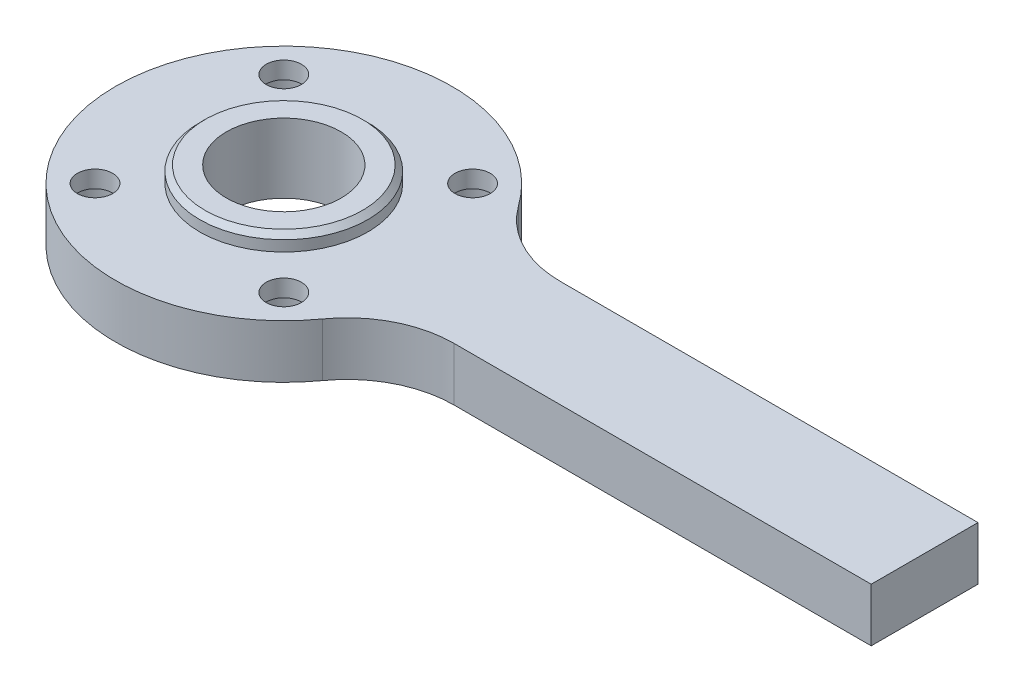
ISO-10303-21;
HEADER;
FILE_DESCRIPTION(('STEP AP214'),'2;1');
FILE_NAME('part.step','',(''),(''),'','','');
FILE_SCHEMA(('AUTOMOTIVE_DESIGN { 1 0 10303 214 1 1 1 1 }'));
ENDSEC;
DATA;
#1=APPLICATION_CONTEXT('core data for automotive mechanical design processes');
#2=APPLICATION_PROTOCOL_DEFINITION('international standard','automotive_design',2000,#1);
#3=PRODUCT_CONTEXT('',#1,'mechanical');
#4=PRODUCT('Part','Part','',(#3));
#5=PRODUCT_RELATED_PRODUCT_CATEGORY('part','',(#4));
#6=PRODUCT_DEFINITION_FORMATION('','',#4);
#7=PRODUCT_DEFINITION_CONTEXT('part definition',#1,'design');
#8=PRODUCT_DEFINITION('design','',#6,#7);
#9=PRODUCT_DEFINITION_SHAPE('','',#8);
#10=(LENGTH_UNIT() NAMED_UNIT(*) SI_UNIT(.MILLI.,.METRE.));
#11=(NAMED_UNIT(*) PLANE_ANGLE_UNIT() SI_UNIT($,.RADIAN.));
#12=(NAMED_UNIT(*) SI_UNIT($,.STERADIAN.) SOLID_ANGLE_UNIT());
#13=UNCERTAINTY_MEASURE_WITH_UNIT(LENGTH_MEASURE(1.E-05),#10,'distance_accuracy_value','');
#14=(GEOMETRIC_REPRESENTATION_CONTEXT(3) GLOBAL_UNCERTAINTY_ASSIGNED_CONTEXT((#13)) GLOBAL_UNIT_ASSIGNED_CONTEXT((#10,
#11,#12)) REPRESENTATION_CONTEXT('',''));
#15=CARTESIAN_POINT('',(0.,0.,0.));
#16=DIRECTION('',(0.,0.,1.));
#17=DIRECTION('',(1.,0.,0.));
#18=AXIS2_PLACEMENT_3D('',#15,#16,#17);
#19=CARTESIAN_POINT('',(0.,10.,0.));
#20=DIRECTION('',(0.,-1.,0.));
#21=DIRECTION('',(0.,0.,-1.));
#22=AXIS2_PLACEMENT_3D('',#19,#20,#21);
#23=CYLINDRICAL_SURFACE('',#22,31.5);
#24=CARTESIAN_POINT('',(0.,0.,0.));
#25=DIRECTION('',(0.,1.,0.));
#26=DIRECTION('',(0.,0.,1.));
#27=AXIS2_PLACEMENT_3D('',#24,#25,#26);
#28=CIRCLE('',#27,31.5);
#29=CARTESIAN_POINT('',(25.6036191835907,0.,-18.3495145631068));
#30=VERTEX_POINT('',#29);
#31=CARTESIAN_POINT('',(25.6036191835907,0.,18.3495145631068));
#32=VERTEX_POINT('',#31);
#33=EDGE_CURVE('E157',#30,#32,#28,.T.);
#34=ORIENTED_EDGE('',*,*,#33,.T.);
#35=DIRECTION('',(0.,-1.,0.));
#36=VECTOR('',#35,1.);
#37=CARTESIAN_POINT('',(25.6036191835907,10.,18.3495145631068));
#38=LINE('',#37,#36);
#39=CARTESIAN_POINT('',(25.6036191835907,10.,18.3495145631068));
#40=VERTEX_POINT('',#39);
#41=EDGE_CURVE('E56',#32,#40,#38,.F.);
#42=ORIENTED_EDGE('',*,*,#41,.T.);
#43=CARTESIAN_POINT('',(0.,10.,0.));
#44=DIRECTION('',(0.,1.,0.));
#45=DIRECTION('',(0.,0.,1.));
#46=AXIS2_PLACEMENT_3D('',#43,#44,#45);
#47=CIRCLE('',#46,31.5);
#48=CARTESIAN_POINT('',(25.6036191835907,10.,-18.3495145631068));
#49=VERTEX_POINT('',#48);
#50=EDGE_CURVE('E162',#49,#40,#47,.T.);
#51=ORIENTED_EDGE('',*,*,#50,.F.);
#52=DIRECTION('',(0.,-1.,0.));
#53=VECTOR('',#52,1.);
#54=CARTESIAN_POINT('',(25.6036191835907,10.,-18.3495145631068));
#55=LINE('',#54,#53);
#56=EDGE_CURVE('E181',#49,#30,#55,.T.);
#57=ORIENTED_EDGE('',*,*,#56,.T.);
#58=EDGE_LOOP('',(#34,#42,#51,#57));
#59=FACE_BOUND('',#58,.T.);
#60=ADVANCED_FACE('F35',(#59),#23,.T.);
#61=CARTESIAN_POINT('',(0.,0.,0.));
#62=DIRECTION('',(0.,1.,0.));
#63=DIRECTION('',(0.,0.,1.));
#64=AXIS2_PLACEMENT_3D('',#61,#62,#63);
#65=PLANE('',#64);
#66=CARTESIAN_POINT('',(0.,0.,0.));
#67=DIRECTION('',(0.,-1.,0.));
#68=DIRECTION('',(0.,0.,-1.));
#69=AXIS2_PLACEMENT_3D('',#66,#67,#68);
#70=CIRCLE('',#69,10.75);
#71=CARTESIAN_POINT('',(0.,0.,-10.75));
#72=VERTEX_POINT('',#71);
#73=EDGE_CURVE('E203',#72,#72,#70,.T.);
#74=ORIENTED_EDGE('',*,*,#73,.F.);
#75=EDGE_LOOP('',(#74));
#76=FACE_BOUND('',#75,.T.);
#77=ORIENTED_EDGE('',*,*,#33,.F.);
#78=CARTESIAN_POINT('',(41.8598853319022,0.,-30.));
#79=DIRECTION('',(0.,1.,0.));
#80=DIRECTION('',(0.,0.,1.));
#81=AXIS2_PLACEMENT_3D('',#78,#79,#80);
#82=CIRCLE('',#81,20.);
#83=CARTESIAN_POINT('',(41.8598853319022,0.,-10.));
#84=VERTEX_POINT('',#83);
#85=EDGE_CURVE('E185',#30,#84,#82,.T.);
#86=ORIENTED_EDGE('',*,*,#85,.T.);
#87=DIRECTION('',(-1.,0.,0.));
#88=VECTOR('',#87,1.);
#89=CARTESIAN_POINT('',(120.,0.,-10.));
#90=LINE('',#89,#88);
#91=CARTESIAN_POINT('',(120.,0.,-10.));
#92=VERTEX_POINT('',#91);
#93=EDGE_CURVE('E198',#92,#84,#90,.T.);
#94=ORIENTED_EDGE('',*,*,#93,.F.);
#95=DIRECTION('',(0.,0.,-1.));
#96=VECTOR('',#95,1.);
#97=CARTESIAN_POINT('',(120.,0.,10.));
#98=LINE('',#97,#96);
#99=CARTESIAN_POINT('',(120.,0.,10.));
#100=VERTEX_POINT('',#99);
#101=EDGE_CURVE('E104',#100,#92,#98,.T.);
#102=ORIENTED_EDGE('',*,*,#101,.F.);
#103=DIRECTION('',(-1.,0.,0.));
#104=VECTOR('',#103,1.);
#105=CARTESIAN_POINT('',(120.,0.,10.));
#106=LINE('',#105,#104);
#107=CARTESIAN_POINT('',(41.8598853319022,0.,10.));
#108=VERTEX_POINT('',#107);
#109=EDGE_CURVE('E119',#100,#108,#106,.T.);
#110=ORIENTED_EDGE('',*,*,#109,.T.);
#111=CARTESIAN_POINT('',(41.8598853319022,0.,30.));
#112=DIRECTION('',(0.,1.,0.));
#113=DIRECTION('',(0.,0.,1.));
#114=AXIS2_PLACEMENT_3D('',#111,#112,#113);
#115=CIRCLE('',#114,20.);
#116=EDGE_CURVE('E43',#108,#32,#115,.T.);
#117=ORIENTED_EDGE('',*,*,#116,.T.);
#118=EDGE_LOOP('',(#77,#86,#94,#102,#110,#117));
#119=FACE_BOUND('',#118,.T.);
#120=CARTESIAN_POINT('',(17.6776695296637,0.,17.6776695296637));
#121=DIRECTION('',(0.,-1.,0.));
#122=DIRECTION('',(0.,0.,-1.));
#123=AXIS2_PLACEMENT_3D('',#120,#121,#122);
#124=CIRCLE('',#123,5.50000000000002);
#125=CARTESIAN_POINT('',(17.6776695296637,0.,12.1776695296637));
#126=VERTEX_POINT('',#125);
#127=EDGE_CURVE('E126',#126,#126,#124,.T.);
#128=ORIENTED_EDGE('',*,*,#127,.F.);
#129=EDGE_LOOP('',(#128));
#130=FACE_BOUND('',#129,.T.);
#131=CARTESIAN_POINT('',(-17.6776695296637,0.,17.6776695296637));
#132=DIRECTION('',(0.,1.,0.));
#133=DIRECTION('',(0.,0.,1.));
#134=AXIS2_PLACEMENT_3D('',#131,#132,#133);
#135=CIRCLE('',#134,5.50000000000002);
#136=CARTESIAN_POINT('',(-17.6776695296637,0.,23.1776695296637));
#137=VERTEX_POINT('',#136);
#138=EDGE_CURVE('E129',#137,#137,#135,.T.);
#139=ORIENTED_EDGE('',*,*,#138,.T.);
#140=EDGE_LOOP('',(#139));
#141=FACE_BOUND('',#140,.T.);
#142=CARTESIAN_POINT('',(17.6776695296637,0.,-17.6776695296637));
#143=DIRECTION('',(0.,1.,0.));
#144=DIRECTION('',(0.,0.,1.));
#145=AXIS2_PLACEMENT_3D('',#142,#143,#144);
#146=CIRCLE('',#145,5.50000000000002);
#147=CARTESIAN_POINT('',(17.6776695296637,0.,-12.1776695296637));
#148=VERTEX_POINT('',#147);
#149=EDGE_CURVE('E117',#148,#148,#146,.T.);
#150=ORIENTED_EDGE('',*,*,#149,.T.);
#151=EDGE_LOOP('',(#150));
#152=FACE_BOUND('',#151,.T.);
#153=CARTESIAN_POINT('',(-17.6776695296637,0.,-17.6776695296637));
#154=DIRECTION('',(0.,-1.,0.));
#155=DIRECTION('',(0.,0.,-1.));
#156=AXIS2_PLACEMENT_3D('',#153,#154,#155);
#157=CIRCLE('',#156,5.50000000000002);
#158=CARTESIAN_POINT('',(-17.6776695296637,0.,-23.1776695296637));
#159=VERTEX_POINT('',#158);
#160=EDGE_CURVE('E133',#159,#159,#157,.T.);
#161=ORIENTED_EDGE('',*,*,#160,.F.);
#162=EDGE_LOOP('',(#161));
#163=FACE_BOUND('',#162,.T.);
#164=ADVANCED_FACE('F196',(#76,#119,#130,#141,#152,#163),#65,.F.);
#165=CARTESIAN_POINT('',(-17.6776695296637,13.,-17.6776695296637));
#166=DIRECTION('',(0.,-1.,0.));
#167=DIRECTION('',(0.,0.,-1.));
#168=AXIS2_PLACEMENT_3D('',#165,#166,#167);
#169=CYLINDRICAL_SURFACE('',#168,3.30000000000002);
#170=CARTESIAN_POINT('',(-17.6776695296637,10.,-17.6776695296637));
#171=DIRECTION('',(0.,1.,0.));
#172=DIRECTION('',(0.,0.,1.));
#173=AXIS2_PLACEMENT_3D('',#170,#171,#172);
#174=CIRCLE('',#173,3.30000000000002);
#175=CARTESIAN_POINT('',(-17.6776695296637,10.,-14.3776695296637));
#176=VERTEX_POINT('',#175);
#177=EDGE_CURVE('E151',#176,#176,#174,.T.);
#178=ORIENTED_EDGE('',*,*,#177,.T.);
#179=EDGE_LOOP('',(#178));
#180=FACE_BOUND('',#179,.T.);
#181=CARTESIAN_POINT('',(-17.6776695296637,6.8,-17.6776695296637));
#182=DIRECTION('',(0.,-1.,0.));
#183=DIRECTION('',(0.,0.,-1.));
#184=AXIS2_PLACEMENT_3D('',#181,#182,#183);
#185=CIRCLE('',#184,3.30000000000002);
#186=CARTESIAN_POINT('',(-17.6776695296637,6.8,-20.9776695296637));
#187=VERTEX_POINT('',#186);
#188=EDGE_CURVE('E167',#187,#187,#185,.F.);
#189=ORIENTED_EDGE('',*,*,#188,.F.);
#190=EDGE_LOOP('',(#189));
#191=FACE_BOUND('',#190,.T.);
#192=ADVANCED_FACE('F219',(#180,#191),#169,.F.);
#193=CARTESIAN_POINT('',(17.6776695296637,13.,17.6776695296637));
#194=DIRECTION('',(0.,-1.,0.));
#195=DIRECTION('',(0.,0.,-1.));
#196=AXIS2_PLACEMENT_3D('',#193,#194,#195);
#197=CYLINDRICAL_SURFACE('',#196,3.30000000000002);
#198=CARTESIAN_POINT('',(17.6776695296637,10.,17.6776695296637));
#199=DIRECTION('',(0.,1.,0.));
#200=DIRECTION('',(0.,0.,1.));
#201=AXIS2_PLACEMENT_3D('',#198,#199,#200);
#202=CIRCLE('',#201,3.30000000000002);
#203=CARTESIAN_POINT('',(17.6776695296637,10.,20.9776695296637));
#204=VERTEX_POINT('',#203);
#205=EDGE_CURVE('E154',#204,#204,#202,.T.);
#206=ORIENTED_EDGE('',*,*,#205,.T.);
#207=EDGE_LOOP('',(#206));
#208=FACE_BOUND('',#207,.T.);
#209=CARTESIAN_POINT('',(17.6776695296637,6.8,17.6776695296637));
#210=DIRECTION('',(0.,-1.,0.));
#211=DIRECTION('',(0.,0.,-1.));
#212=AXIS2_PLACEMENT_3D('',#209,#210,#211);
#213=CIRCLE('',#212,3.30000000000002);
#214=CARTESIAN_POINT('',(17.6776695296637,6.8,14.3776695296637));
#215=VERTEX_POINT('',#214);
#216=EDGE_CURVE('E141',#215,#215,#213,.F.);
#217=ORIENTED_EDGE('',*,*,#216,.F.);
#218=EDGE_LOOP('',(#217));
#219=FACE_BOUND('',#218,.T.);
#220=ADVANCED_FACE('F225',(#208,#219),#197,.F.);
#221=CARTESIAN_POINT('',(0.,10.,0.));
#222=DIRECTION('',(0.,1.,0.));
#223=DIRECTION('',(0.,0.,1.));
#224=AXIS2_PLACEMENT_3D('',#221,#222,#223);
#225=PLANE('',#224);
#226=DIRECTION('',(-1.,0.,0.));
#227=VECTOR('',#226,1.);
#228=CARTESIAN_POINT('',(120.,10.,-9.99999999999999));
#229=LINE('',#228,#227);
#230=CARTESIAN_POINT('',(120.,10.,-9.99999999999999));
#231=VERTEX_POINT('',#230);
#232=CARTESIAN_POINT('',(41.8598853319022,10.,-9.99999999999999));
#233=VERTEX_POINT('',#232);
#234=EDGE_CURVE('E93',#231,#233,#229,.T.);
#235=ORIENTED_EDGE('',*,*,#234,.T.);
#236=CARTESIAN_POINT('',(41.8598853319022,10.,-30.));
#237=DIRECTION('',(0.,1.,0.));
#238=DIRECTION('',(0.,0.,1.));
#239=AXIS2_PLACEMENT_3D('',#236,#237,#238);
#240=CIRCLE('',#239,20.);
#241=EDGE_CURVE('E183',#233,#49,#240,.F.);
#242=ORIENTED_EDGE('',*,*,#241,.T.);
#243=ORIENTED_EDGE('',*,*,#50,.T.);
#244=CARTESIAN_POINT('',(41.8598853319022,10.,30.));
#245=DIRECTION('',(0.,1.,0.));
#246=DIRECTION('',(0.,0.,1.));
#247=AXIS2_PLACEMENT_3D('',#244,#245,#246);
#248=CIRCLE('',#247,20.);
#249=CARTESIAN_POINT('',(41.8598853319022,10.,10.));
#250=VERTEX_POINT('',#249);
#251=EDGE_CURVE('E11',#40,#250,#248,.F.);
#252=ORIENTED_EDGE('',*,*,#251,.T.);
#253=DIRECTION('',(-1.,0.,0.));
#254=VECTOR('',#253,1.);
#255=CARTESIAN_POINT('',(120.,10.,10.));
#256=LINE('',#255,#254);
#257=CARTESIAN_POINT('',(120.,10.,10.));
#258=VERTEX_POINT('',#257);
#259=EDGE_CURVE('E95',#258,#250,#256,.T.);
#260=ORIENTED_EDGE('',*,*,#259,.F.);
#261=DIRECTION('',(0.,0.,1.));
#262=VECTOR('',#261,1.);
#263=CARTESIAN_POINT('',(120.,10.,10.));
#264=LINE('',#263,#262);
#265=EDGE_CURVE('E88',#231,#258,#264,.T.);
#266=ORIENTED_EDGE('',*,*,#265,.F.);
#267=EDGE_LOOP('',(#235,#242,#243,#252,#260,#266));
#268=FACE_BOUND('',#267,.T.);
#269=CARTESIAN_POINT('',(0.,10.,0.));
#270=DIRECTION('',(0.,1.,0.));
#271=DIRECTION('',(0.,0.,1.));
#272=AXIS2_PLACEMENT_3D('',#269,#270,#271);
#273=CIRCLE('',#272,15.75);
#274=CARTESIAN_POINT('',(0.,10.,15.75));
#275=VERTEX_POINT('',#274);
#276=EDGE_CURVE('E158',#275,#275,#273,.T.);
#277=ORIENTED_EDGE('',*,*,#276,.F.);
#278=EDGE_LOOP('',(#277));
#279=FACE_BOUND('',#278,.T.);
#280=CARTESIAN_POINT('',(17.6776695296637,10.,-17.6776695296637));
#281=DIRECTION('',(0.,1.,0.));
#282=DIRECTION('',(0.,0.,1.));
#283=AXIS2_PLACEMENT_3D('',#280,#281,#282);
#284=CIRCLE('',#283,3.30000000000002);
#285=CARTESIAN_POINT('',(17.6776695296637,10.,-14.3776695296637));
#286=VERTEX_POINT('',#285);
#287=EDGE_CURVE('E147',#286,#286,#284,.F.);
#288=ORIENTED_EDGE('',*,*,#287,.T.);
#289=EDGE_LOOP('',(#288));
#290=FACE_BOUND('',#289,.T.);
#291=CARTESIAN_POINT('',(-17.6776695296637,10.,17.6776695296637));
#292=DIRECTION('',(0.,1.,0.));
#293=DIRECTION('',(0.,0.,1.));
#294=AXIS2_PLACEMENT_3D('',#291,#292,#293);
#295=CIRCLE('',#294,3.30000000000002);
#296=CARTESIAN_POINT('',(-17.6776695296637,10.,20.9776695296637));
#297=VERTEX_POINT('',#296);
#298=EDGE_CURVE('E144',#297,#297,#295,.F.);
#299=ORIENTED_EDGE('',*,*,#298,.T.);
#300=EDGE_LOOP('',(#299));
#301=FACE_BOUND('',#300,.T.);
#302=ORIENTED_EDGE('',*,*,#177,.F.);
#303=EDGE_LOOP('',(#302));
#304=FACE_BOUND('',#303,.T.);
#305=ORIENTED_EDGE('',*,*,#205,.F.);
#306=EDGE_LOOP('',(#305));
#307=FACE_BOUND('',#306,.T.);
#308=ADVANCED_FACE('F90',(#268,#279,#290,#301,#304,#307),#225,.T.);
#309=CARTESIAN_POINT('',(0.,13.,0.));
#310=DIRECTION('',(0.,-1.,0.));
#311=DIRECTION('',(0.,0.,-1.));
#312=AXIS2_PLACEMENT_3D('',#309,#310,#311);
#313=CYLINDRICAL_SURFACE('',#312,15.75);
#314=CARTESIAN_POINT('',(0.,12.,0.));
#315=DIRECTION('',(0.,1.,0.));
#316=DIRECTION('',(0.,0.,1.));
#317=AXIS2_PLACEMENT_3D('',#314,#315,#316);
#318=CIRCLE('',#317,15.75);
#319=CARTESIAN_POINT('',(0.,12.,15.75));
#320=VERTEX_POINT('',#319);
#321=EDGE_CURVE('E177',#320,#320,#318,.F.);
#322=ORIENTED_EDGE('',*,*,#321,.T.);
#323=EDGE_LOOP('',(#322));
#324=FACE_BOUND('',#323,.T.);
#325=ORIENTED_EDGE('',*,*,#276,.T.);
#326=EDGE_LOOP('',(#325));
#327=FACE_BOUND('',#326,.T.);
#328=ADVANCED_FACE('F268',(#324,#327),#313,.T.);
#329=CARTESIAN_POINT('',(0.,13.,0.));
#330=DIRECTION('',(0.,1.,0.));
#331=DIRECTION('',(0.,0.,1.));
#332=AXIS2_PLACEMENT_3D('',#329,#330,#331);
#333=PLANE('',#332);
#334=CARTESIAN_POINT('',(0.,13.,0.));
#335=DIRECTION('',(0.,1.,0.));
#336=DIRECTION('',(0.,0.,1.));
#337=AXIS2_PLACEMENT_3D('',#334,#335,#336);
#338=CIRCLE('',#337,14.75);
#339=CARTESIAN_POINT('',(0.,13.,14.75));
#340=VERTEX_POINT('',#339);
#341=EDGE_CURVE('E161',#340,#340,#338,.T.);
#342=ORIENTED_EDGE('',*,*,#341,.T.);
#343=EDGE_LOOP('',(#342));
#344=FACE_BOUND('',#343,.T.);
#345=CARTESIAN_POINT('',(0.,13.,0.));
#346=DIRECTION('',(0.,-1.,0.));
#347=DIRECTION('',(0.,0.,-1.));
#348=AXIS2_PLACEMENT_3D('',#345,#346,#347);
#349=CIRCLE('',#348,10.75);
#350=CARTESIAN_POINT('',(0.,13.,-10.75));
#351=VERTEX_POINT('',#350);
#352=EDGE_CURVE('E108',#351,#351,#349,.T.);
#353=ORIENTED_EDGE('',*,*,#352,.T.);
#354=EDGE_LOOP('',(#353));
#355=FACE_BOUND('',#354,.T.);
#356=ADVANCED_FACE('F209',(#344,#355),#333,.T.);
#357=CARTESIAN_POINT('',(-17.6776695296637,13.,17.6776695296637));
#358=DIRECTION('',(0.,-1.,0.));
#359=DIRECTION('',(0.,0.,-1.));
#360=AXIS2_PLACEMENT_3D('',#357,#358,#359);
#361=CYLINDRICAL_SURFACE('',#360,3.30000000000002);
#362=CARTESIAN_POINT('',(-17.6776695296637,6.8,17.6776695296637));
#363=DIRECTION('',(0.,1.,0.));
#364=DIRECTION('',(0.,0.,1.));
#365=AXIS2_PLACEMENT_3D('',#362,#363,#364);
#366=CIRCLE('',#365,3.30000000000002);
#367=CARTESIAN_POINT('',(-17.6776695296637,6.8,20.9776695296637));
#368=VERTEX_POINT('',#367);
#369=EDGE_CURVE('E148',#368,#368,#366,.T.);
#370=ORIENTED_EDGE('',*,*,#369,.F.);
#371=EDGE_LOOP('',(#370));
#372=FACE_BOUND('',#371,.T.);
#373=ORIENTED_EDGE('',*,*,#298,.F.);
#374=EDGE_LOOP('',(#373));
#375=FACE_BOUND('',#374,.T.);
#376=ADVANCED_FACE('F310',(#372,#375),#361,.F.);
#377=CARTESIAN_POINT('',(17.6776695296637,13.,-17.6776695296637));
#378=DIRECTION('',(0.,-1.,0.));
#379=DIRECTION('',(0.,0.,-1.));
#380=AXIS2_PLACEMENT_3D('',#377,#378,#379);
#381=CYLINDRICAL_SURFACE('',#380,3.30000000000002);
#382=CARTESIAN_POINT('',(17.6776695296637,6.8,-17.6776695296637));
#383=DIRECTION('',(0.,1.,0.));
#384=DIRECTION('',(0.,0.,1.));
#385=AXIS2_PLACEMENT_3D('',#382,#383,#384);
#386=CIRCLE('',#385,3.30000000000002);
#387=CARTESIAN_POINT('',(17.6776695296637,6.8,-14.3776695296637));
#388=VERTEX_POINT('',#387);
#389=EDGE_CURVE('E170',#388,#388,#386,.T.);
#390=ORIENTED_EDGE('',*,*,#389,.F.);
#391=EDGE_LOOP('',(#390));
#392=FACE_BOUND('',#391,.T.);
#393=ORIENTED_EDGE('',*,*,#287,.F.);
#394=EDGE_LOOP('',(#393));
#395=FACE_BOUND('',#394,.T.);
#396=ADVANCED_FACE('F407',(#392,#395),#381,.F.);
#397=CARTESIAN_POINT('',(17.6776695296637,6.8,17.6776695296637));
#398=DIRECTION('',(0.,-1.,0.));
#399=DIRECTION('',(0.,0.,-1.));
#400=AXIS2_PLACEMENT_3D('',#397,#398,#399);
#401=PLANE('',#400);
#402=CARTESIAN_POINT('',(17.6776695296637,6.8,17.6776695296637));
#403=DIRECTION('',(0.,-1.,0.));
#404=DIRECTION('',(0.,0.,-1.));
#405=AXIS2_PLACEMENT_3D('',#402,#403,#404);
#406=CIRCLE('',#405,5.50000000000002);
#407=CARTESIAN_POINT('',(17.6776695296637,6.8,12.1776695296637));
#408=VERTEX_POINT('',#407);
#409=EDGE_CURVE('E130',#408,#408,#406,.T.);
#410=ORIENTED_EDGE('',*,*,#409,.T.);
#411=EDGE_LOOP('',(#410));
#412=FACE_BOUND('',#411,.T.);
#413=ORIENTED_EDGE('',*,*,#216,.T.);
#414=EDGE_LOOP('',(#413));
#415=FACE_BOUND('',#414,.T.);
#416=ADVANCED_FACE('F397',(#412,#415),#401,.T.);
#417=CARTESIAN_POINT('',(17.6776695296637,6.8,17.6776695296637));
#418=DIRECTION('',(0.,-1.,0.));
#419=DIRECTION('',(0.,0.,-1.));
#420=AXIS2_PLACEMENT_3D('',#417,#418,#419);
#421=CYLINDRICAL_SURFACE('',#420,5.50000000000002);
#422=ORIENTED_EDGE('',*,*,#409,.F.);
#423=EDGE_LOOP('',(#422));
#424=FACE_BOUND('',#423,.T.);
#425=ORIENTED_EDGE('',*,*,#127,.T.);
#426=EDGE_LOOP('',(#425));
#427=FACE_BOUND('',#426,.T.);
#428=ADVANCED_FACE('F387',(#424,#427),#421,.F.);
#429=CARTESIAN_POINT('',(-17.6776695296637,6.8,-17.6776695296637));
#430=DIRECTION('',(0.,-1.,0.));
#431=DIRECTION('',(0.,0.,-1.));
#432=AXIS2_PLACEMENT_3D('',#429,#430,#431);
#433=PLANE('',#432);
#434=CARTESIAN_POINT('',(-17.6776695296637,6.8,-17.6776695296637));
#435=DIRECTION('',(0.,-1.,0.));
#436=DIRECTION('',(0.,0.,-1.));
#437=AXIS2_PLACEMENT_3D('',#434,#435,#436);
#438=CIRCLE('',#437,5.50000000000002);
#439=CARTESIAN_POINT('',(-17.6776695296637,6.8,-23.1776695296637));
#440=VERTEX_POINT('',#439);
#441=EDGE_CURVE('E124',#440,#440,#438,.T.);
#442=ORIENTED_EDGE('',*,*,#441,.T.);
#443=EDGE_LOOP('',(#442));
#444=FACE_BOUND('',#443,.T.);
#445=ORIENTED_EDGE('',*,*,#188,.T.);
#446=EDGE_LOOP('',(#445));
#447=FACE_BOUND('',#446,.T.);
#448=ADVANCED_FACE('F377',(#444,#447),#433,.T.);
#449=CARTESIAN_POINT('',(-17.6776695296637,6.8,-17.6776695296637));
#450=DIRECTION('',(0.,-1.,0.));
#451=DIRECTION('',(0.,0.,-1.));
#452=AXIS2_PLACEMENT_3D('',#449,#450,#451);
#453=CYLINDRICAL_SURFACE('',#452,5.50000000000002);
#454=ORIENTED_EDGE('',*,*,#441,.F.);
#455=EDGE_LOOP('',(#454));
#456=FACE_BOUND('',#455,.T.);
#457=ORIENTED_EDGE('',*,*,#160,.T.);
#458=EDGE_LOOP('',(#457));
#459=FACE_BOUND('',#458,.T.);
#460=ADVANCED_FACE('F367',(#456,#459),#453,.F.);
#461=CARTESIAN_POINT('',(17.6776695296637,6.8,-17.6776695296637));
#462=DIRECTION('',(0.,-1.,0.));
#463=DIRECTION('',(0.,0.,-1.));
#464=AXIS2_PLACEMENT_3D('',#461,#462,#463);
#465=CYLINDRICAL_SURFACE('',#464,5.50000000000002);
#466=CARTESIAN_POINT('',(17.6776695296637,6.8,-17.6776695296637));
#467=DIRECTION('',(0.,1.,0.));
#468=DIRECTION('',(0.,0.,1.));
#469=AXIS2_PLACEMENT_3D('',#466,#467,#468);
#470=CIRCLE('',#469,5.50000000000002);
#471=CARTESIAN_POINT('',(17.6776695296637,6.8,-12.1776695296637));
#472=VERTEX_POINT('',#471);
#473=EDGE_CURVE('E114',#472,#472,#470,.T.);
#474=ORIENTED_EDGE('',*,*,#473,.T.);
#475=EDGE_LOOP('',(#474));
#476=FACE_BOUND('',#475,.T.);
#477=ORIENTED_EDGE('',*,*,#149,.F.);
#478=EDGE_LOOP('',(#477));
#479=FACE_BOUND('',#478,.T.);
#480=ADVANCED_FACE('F357',(#476,#479),#465,.F.);
#481=CARTESIAN_POINT('',(17.6776695296637,6.8,-17.6776695296637));
#482=DIRECTION('',(0.,1.,0.));
#483=DIRECTION('',(0.,0.,1.));
#484=AXIS2_PLACEMENT_3D('',#481,#482,#483);
#485=PLANE('',#484);
#486=ORIENTED_EDGE('',*,*,#389,.T.);
#487=EDGE_LOOP('',(#486));
#488=FACE_BOUND('',#487,.T.);
#489=ORIENTED_EDGE('',*,*,#473,.F.);
#490=EDGE_LOOP('',(#489));
#491=FACE_BOUND('',#490,.T.);
#492=ADVANCED_FACE('F347',(#488,#491),#485,.F.);
#493=CARTESIAN_POINT('',(-17.6776695296637,6.8,17.6776695296637));
#494=DIRECTION('',(0.,-1.,0.));
#495=DIRECTION('',(0.,0.,-1.));
#496=AXIS2_PLACEMENT_3D('',#493,#494,#495);
#497=CYLINDRICAL_SURFACE('',#496,5.50000000000002);
#498=CARTESIAN_POINT('',(-17.6776695296637,6.8,17.6776695296637));
#499=DIRECTION('',(0.,1.,0.));
#500=DIRECTION('',(0.,0.,1.));
#501=AXIS2_PLACEMENT_3D('',#498,#499,#500);
#502=CIRCLE('',#501,5.50000000000002);
#503=CARTESIAN_POINT('',(-17.6776695296637,6.8,23.1776695296637));
#504=VERTEX_POINT('',#503);
#505=EDGE_CURVE('E138',#504,#504,#502,.T.);
#506=ORIENTED_EDGE('',*,*,#505,.T.);
#507=EDGE_LOOP('',(#506));
#508=FACE_BOUND('',#507,.T.);
#509=ORIENTED_EDGE('',*,*,#138,.F.);
#510=EDGE_LOOP('',(#509));
#511=FACE_BOUND('',#510,.T.);
#512=ADVANCED_FACE('F337',(#508,#511),#497,.F.);
#513=CARTESIAN_POINT('',(-17.6776695296637,6.8,17.6776695296637));
#514=DIRECTION('',(0.,1.,0.));
#515=DIRECTION('',(0.,0.,1.));
#516=AXIS2_PLACEMENT_3D('',#513,#514,#515);
#517=PLANE('',#516);
#518=ORIENTED_EDGE('',*,*,#369,.T.);
#519=EDGE_LOOP('',(#518));
#520=FACE_BOUND('',#519,.T.);
#521=ORIENTED_EDGE('',*,*,#505,.F.);
#522=EDGE_LOOP('',(#521));
#523=FACE_BOUND('',#522,.T.);
#524=ADVANCED_FACE('F294',(#520,#523),#517,.F.);
#525=CARTESIAN_POINT('',(120.,10.,-9.99999999999999));
#526=DIRECTION('',(0.,0.,1.));
#527=DIRECTION('',(0.,-1.,0.));
#528=AXIS2_PLACEMENT_3D('',#525,#526,#527);
#529=PLANE('',#528);
#530=ORIENTED_EDGE('',*,*,#93,.T.);
#531=DIRECTION('',(0.,1.,0.));
#532=VECTOR('',#531,1.);
#533=CARTESIAN_POINT('',(41.8598853319022,9.99999999999999,-9.99999999999999));
#534=LINE('',#533,#532);
#535=EDGE_CURVE('E113',#84,#233,#534,.T.);
#536=ORIENTED_EDGE('',*,*,#535,.T.);
#537=ORIENTED_EDGE('',*,*,#234,.F.);
#538=DIRECTION('',(0.,1.,0.));
#539=VECTOR('',#538,1.);
#540=CARTESIAN_POINT('',(120.,10.,-9.99999999999999));
#541=LINE('',#540,#539);
#542=EDGE_CURVE('E99',#92,#231,#541,.T.);
#543=ORIENTED_EDGE('',*,*,#542,.F.);
#544=EDGE_LOOP('',(#530,#536,#537,#543));
#545=FACE_BOUND('',#544,.T.);
#546=ADVANCED_FACE('F111',(#545),#529,.F.);
#547=CARTESIAN_POINT('',(120.,10.,10.));
#548=DIRECTION('',(0.,0.,-1.));
#549=DIRECTION('',(0.,1.,0.));
#550=AXIS2_PLACEMENT_3D('',#547,#548,#549);
#551=PLANE('',#550);
#552=ORIENTED_EDGE('',*,*,#259,.T.);
#553=DIRECTION('',(0.,1.,0.));
#554=VECTOR('',#553,1.);
#555=CARTESIAN_POINT('',(41.8598853319022,0.,10.));
#556=LINE('',#555,#554);
#557=EDGE_CURVE('E187',#250,#108,#556,.F.);
#558=ORIENTED_EDGE('',*,*,#557,.T.);
#559=ORIENTED_EDGE('',*,*,#109,.F.);
#560=DIRECTION('',(0.,-1.,0.));
#561=VECTOR('',#560,1.);
#562=CARTESIAN_POINT('',(120.,10.,10.));
#563=LINE('',#562,#561);
#564=EDGE_CURVE('E98',#258,#100,#563,.T.);
#565=ORIENTED_EDGE('',*,*,#564,.F.);
#566=EDGE_LOOP('',(#552,#558,#559,#565));
#567=FACE_BOUND('',#566,.T.);
#568=ADVANCED_FACE('F193',(#567),#551,.F.);
#569=CARTESIAN_POINT('',(120.,0.,0.));
#570=DIRECTION('',(1.,0.,0.));
#571=DIRECTION('',(0.,0.,-1.));
#572=AXIS2_PLACEMENT_3D('',#569,#570,#571);
#573=PLANE('',#572);
#574=ORIENTED_EDGE('',*,*,#542,.T.);
#575=ORIENTED_EDGE('',*,*,#265,.T.);
#576=ORIENTED_EDGE('',*,*,#564,.T.);
#577=ORIENTED_EDGE('',*,*,#101,.T.);
#578=EDGE_LOOP('',(#574,#575,#576,#577));
#579=FACE_BOUND('',#578,.T.);
#580=ADVANCED_FACE('F102',(#579),#573,.T.);
#581=CARTESIAN_POINT('',(0.,13.,0.));
#582=DIRECTION('',(0.,-1.,0.));
#583=DIRECTION('',(0.,0.,-1.));
#584=AXIS2_PLACEMENT_3D('',#581,#582,#583);
#585=CYLINDRICAL_SURFACE('',#584,10.75);
#586=ORIENTED_EDGE('',*,*,#352,.F.);
#587=EDGE_LOOP('',(#586));
#588=FACE_BOUND('',#587,.T.);
#589=ORIENTED_EDGE('',*,*,#73,.T.);
#590=EDGE_LOOP('',(#589));
#591=FACE_BOUND('',#590,.T.);
#592=ADVANCED_FACE('F211',(#588,#591),#585,.F.);
#593=CARTESIAN_POINT('',(0.,13.,0.));
#594=DIRECTION('',(0.,-1.,0.));
#595=DIRECTION('',(0.,0.,-1.));
#596=AXIS2_PLACEMENT_3D('',#593,#594,#595);
#597=CONICAL_SURFACE('',#596,14.75,0.785398163397443);
#598=ORIENTED_EDGE('',*,*,#321,.F.);
#599=EDGE_LOOP('',(#598));
#600=FACE_BOUND('',#599,.T.);
#601=ORIENTED_EDGE('',*,*,#341,.F.);
#602=EDGE_LOOP('',(#601));
#603=FACE_BOUND('',#602,.T.);
#604=ADVANCED_FACE('F214',(#600,#603),#597,.T.);
#605=CARTESIAN_POINT('',(41.8598853319022,10.,-30.));
#606=DIRECTION('',(0.,-1.,0.));
#607=DIRECTION('',(0.,0.,-1.));
#608=AXIS2_PLACEMENT_3D('',#605,#606,#607);
#609=CYLINDRICAL_SURFACE('',#608,20.);
#610=ORIENTED_EDGE('',*,*,#85,.F.);
#611=ORIENTED_EDGE('',*,*,#56,.F.);
#612=ORIENTED_EDGE('',*,*,#241,.F.);
#613=ORIENTED_EDGE('',*,*,#535,.F.);
#614=EDGE_LOOP('',(#610,#611,#612,#613));
#615=FACE_BOUND('',#614,.T.);
#616=ADVANCED_FACE('F236',(#615),#609,.F.);
#617=CARTESIAN_POINT('',(41.8598853319022,9.99999999999999,30.));
#618=DIRECTION('',(0.,-1.,0.));
#619=DIRECTION('',(0.,0.,-1.));
#620=AXIS2_PLACEMENT_3D('',#617,#618,#619);
#621=CYLINDRICAL_SURFACE('',#620,20.);
#622=ORIENTED_EDGE('',*,*,#251,.F.);
#623=ORIENTED_EDGE('',*,*,#41,.F.);
#624=ORIENTED_EDGE('',*,*,#116,.F.);
#625=ORIENTED_EDGE('',*,*,#557,.F.);
#626=EDGE_LOOP('',(#622,#623,#624,#625));
#627=FACE_BOUND('',#626,.T.);
#628=ADVANCED_FACE('F37',(#627),#621,.F.);
#629=CLOSED_SHELL('',(#60,#164,#192,#220,#308,#328,#356,#376,#396,#416,#428,#448,#460,#480,#492,
#512,#524,#546,#568,#580,#592,#604,#616,#628));
#630=MANIFOLD_SOLID_BREP('B2',#629);
#631=ADVANCED_BREP_SHAPE_REPRESENTATION('',(#18,#630),#14);
#632=SHAPE_DEFINITION_REPRESENTATION(#9,#631);
ENDSEC;
END-ISO-10303-21;
